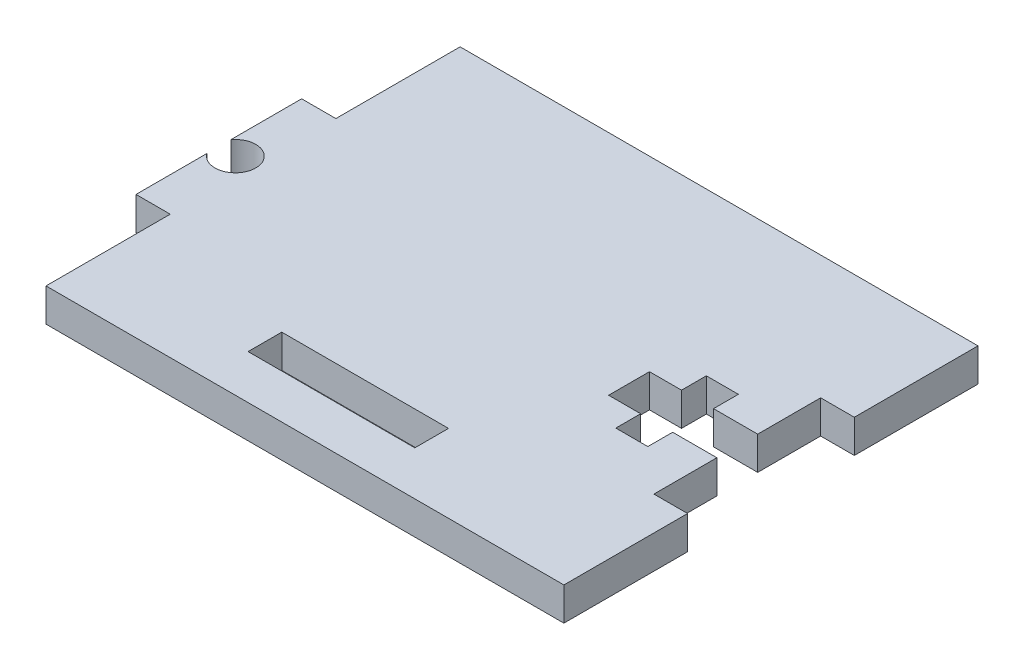
ISO-10303-21;
HEADER;
FILE_DESCRIPTION(('STEP AP214'),'2;1');
FILE_NAME('part.step','',(''),(''),'','','');
FILE_SCHEMA(('AUTOMOTIVE_DESIGN { 1 0 10303 214 1 1 1 1 }'));
ENDSEC;
DATA;
#1=APPLICATION_CONTEXT('core data for automotive mechanical design processes');
#2=APPLICATION_PROTOCOL_DEFINITION('international standard','automotive_design',2000,#1);
#3=PRODUCT_CONTEXT('',#1,'mechanical');
#4=PRODUCT('Part','Part','',(#3));
#5=PRODUCT_RELATED_PRODUCT_CATEGORY('part','',(#4));
#6=PRODUCT_DEFINITION_FORMATION('','',#4);
#7=PRODUCT_DEFINITION_CONTEXT('part definition',#1,'design');
#8=PRODUCT_DEFINITION('design','',#6,#7);
#9=PRODUCT_DEFINITION_SHAPE('','',#8);
#10=(LENGTH_UNIT() NAMED_UNIT(*) SI_UNIT(.MILLI.,.METRE.));
#11=(NAMED_UNIT(*) PLANE_ANGLE_UNIT() SI_UNIT($,.RADIAN.));
#12=(NAMED_UNIT(*) SI_UNIT($,.STERADIAN.) SOLID_ANGLE_UNIT());
#13=UNCERTAINTY_MEASURE_WITH_UNIT(LENGTH_MEASURE(1.E-05),#10,'distance_accuracy_value','');
#14=(GEOMETRIC_REPRESENTATION_CONTEXT(3) GLOBAL_UNCERTAINTY_ASSIGNED_CONTEXT((#13)) GLOBAL_UNIT_ASSIGNED_CONTEXT((#10,
#11,#12)) REPRESENTATION_CONTEXT('',''));
#15=CARTESIAN_POINT('',(0.,0.,0.));
#16=DIRECTION('',(0.,0.,1.));
#17=DIRECTION('',(1.,0.,0.));
#18=AXIS2_PLACEMENT_3D('',#15,#16,#17);
#19=CARTESIAN_POINT('',(-25.,3.,-18.75));
#20=DIRECTION('',(1.,0.,0.));
#21=DIRECTION('',(0.,0.,-1.));
#22=AXIS2_PLACEMENT_3D('',#19,#20,#21);
#23=PLANE('',#22);
#24=DIRECTION('',(0.,0.,1.));
#25=VECTOR('',#24,1.);
#26=CARTESIAN_POINT('',(-25.,3.,-18.75));
#27=LINE('',#26,#25);
#28=CARTESIAN_POINT('',(-25.,3.,1.08282039138538));
#29=VERTEX_POINT('',#28);
#30=CARTESIAN_POINT('',(-25.,3.,7.5));
#31=VERTEX_POINT('',#30);
#32=EDGE_CURVE('E240',#29,#31,#27,.T.);
#33=ORIENTED_EDGE('',*,*,#32,.F.);
#34=DIRECTION('',(0.,-1.,0.));
#35=VECTOR('',#34,1.);
#36=CARTESIAN_POINT('',(-25.,3.,1.08282039138538));
#37=LINE('',#36,#35);
#38=CARTESIAN_POINT('',(-25.,0.,1.08282039138538));
#39=VERTEX_POINT('',#38);
#40=EDGE_CURVE('E11',#29,#39,#37,.T.);
#41=ORIENTED_EDGE('',*,*,#40,.T.);
#42=DIRECTION('',(0.,0.,1.));
#43=VECTOR('',#42,1.);
#44=CARTESIAN_POINT('',(-25.,0.,-18.75));
#45=LINE('',#44,#43);
#46=CARTESIAN_POINT('',(-25.,0.,7.5));
#47=VERTEX_POINT('',#46);
#48=EDGE_CURVE('E238',#39,#47,#45,.T.);
#49=ORIENTED_EDGE('',*,*,#48,.T.);
#50=DIRECTION('',(0.,-1.,0.));
#51=VECTOR('',#50,1.);
#52=CARTESIAN_POINT('',(-25.,3.,7.5));
#53=LINE('',#52,#51);
#54=EDGE_CURVE('E628',#31,#47,#53,.T.);
#55=ORIENTED_EDGE('',*,*,#54,.F.);
#56=EDGE_LOOP('',(#33,#41,#49,#55));
#57=FACE_BOUND('',#56,.T.);
#58=ADVANCED_FACE('F33',(#57),#23,.F.);
#59=CARTESIAN_POINT('',(25.,3.,-18.75));
#60=DIRECTION('',(-1.,0.,0.));
#61=DIRECTION('',(0.,0.,1.));
#62=AXIS2_PLACEMENT_3D('',#59,#60,#61);
#63=PLANE('',#62);
#64=DIRECTION('',(0.,1.,0.));
#65=VECTOR('',#64,1.);
#66=CARTESIAN_POINT('',(25.,0.,7.55));
#67=LINE('',#66,#65);
#68=CARTESIAN_POINT('',(25.,0.,7.55));
#69=VERTEX_POINT('',#68);
#70=CARTESIAN_POINT('',(25.,3.,7.55));
#71=VERTEX_POINT('',#70);
#72=EDGE_CURVE('E691',#69,#71,#67,.T.);
#73=ORIENTED_EDGE('',*,*,#72,.T.);
#74=DIRECTION('',(0.,0.,-1.));
#75=VECTOR('',#74,1.);
#76=CARTESIAN_POINT('',(25.,3.,-18.75));
#77=LINE('',#76,#75);
#78=CARTESIAN_POINT('',(25.,3.,18.75));
#79=VERTEX_POINT('',#78);
#80=EDGE_CURVE('E306',#79,#71,#77,.T.);
#81=ORIENTED_EDGE('',*,*,#80,.F.);
#82=DIRECTION('',(0.,-1.,0.));
#83=VECTOR('',#82,1.);
#84=CARTESIAN_POINT('',(25.,3.,18.75));
#85=LINE('',#84,#83);
#86=CARTESIAN_POINT('',(25.,0.,18.75));
#87=VERTEX_POINT('',#86);
#88=EDGE_CURVE('E256',#79,#87,#85,.T.);
#89=ORIENTED_EDGE('',*,*,#88,.T.);
#90=DIRECTION('',(0.,0.,-1.));
#91=VECTOR('',#90,1.);
#92=CARTESIAN_POINT('',(25.,0.,-18.75));
#93=LINE('',#92,#91);
#94=EDGE_CURVE('E250',#87,#69,#93,.T.);
#95=ORIENTED_EDGE('',*,*,#94,.T.);
#96=EDGE_LOOP('',(#73,#81,#89,#95));
#97=FACE_BOUND('',#96,.T.);
#98=ADVANCED_FACE('F322',(#97),#63,.F.);
#99=CARTESIAN_POINT('',(0.,3.,0.));
#100=DIRECTION('',(0.,1.,0.));
#101=DIRECTION('',(0.,0.,1.));
#102=AXIS2_PLACEMENT_3D('',#99,#100,#101);
#103=PLANE('',#102);
#104=CARTESIAN_POINT('',(-23.5,3.,0.));
#105=DIRECTION('',(0.,-1.,0.));
#106=DIRECTION('',(0.,0.,-1.));
#107=AXIS2_PLACEMENT_3D('',#104,#105,#106);
#108=CIRCLE('',#107,1.85);
#109=CARTESIAN_POINT('',(-25.,3.,-1.08282039138538));
#110=VERTEX_POINT('',#109);
#111=EDGE_CURVE('E48',#110,#29,#108,.T.);
#112=ORIENTED_EDGE('',*,*,#111,.T.);
#113=ORIENTED_EDGE('',*,*,#32,.T.);
#114=DIRECTION('',(1.,0.,0.));
#115=VECTOR('',#114,1.);
#116=CARTESIAN_POINT('',(-25.,3.,7.5));
#117=LINE('',#116,#115);
#118=CARTESIAN_POINT('',(-21.9,3.,7.5));
#119=VERTEX_POINT('',#118);
#120=EDGE_CURVE('E631',#31,#119,#117,.T.);
#121=ORIENTED_EDGE('',*,*,#120,.T.);
#122=DIRECTION('',(0.,0.,1.));
#123=VECTOR('',#122,1.);
#124=CARTESIAN_POINT('',(-21.9,3.,18.75));
#125=LINE('',#124,#123);
#126=CARTESIAN_POINT('',(-21.9,3.,18.75));
#127=VERTEX_POINT('',#126);
#128=EDGE_CURVE('E634',#119,#127,#125,.T.);
#129=ORIENTED_EDGE('',*,*,#128,.T.);
#130=DIRECTION('',(1.,0.,0.));
#131=VECTOR('',#130,1.);
#132=CARTESIAN_POINT('',(-25.,3.,18.75));
#133=LINE('',#132,#131);
#134=EDGE_CURVE('E260',#127,#79,#133,.T.);
#135=ORIENTED_EDGE('',*,*,#134,.T.);
#136=ORIENTED_EDGE('',*,*,#80,.T.);
#137=DIRECTION('',(-1.,0.,0.));
#138=VECTOR('',#137,1.);
#139=CARTESIAN_POINT('',(25.,3.,7.55));
#140=LINE('',#139,#138);
#141=CARTESIAN_POINT('',(21.95,3.,7.55));
#142=VERTEX_POINT('',#141);
#143=EDGE_CURVE('E660',#71,#142,#140,.T.);
#144=ORIENTED_EDGE('',*,*,#143,.T.);
#145=DIRECTION('',(0.,0.,-1.));
#146=VECTOR('',#145,1.);
#147=CARTESIAN_POINT('',(21.95,3.,7.55));
#148=LINE('',#147,#146);
#149=CARTESIAN_POINT('',(21.95,3.,1.85));
#150=VERTEX_POINT('',#149);
#151=EDGE_CURVE('E687',#142,#150,#148,.T.);
#152=ORIENTED_EDGE('',*,*,#151,.T.);
#153=DIRECTION('',(-1.,0.,0.));
#154=VECTOR('',#153,1.);
#155=CARTESIAN_POINT('',(21.95,3.,1.85));
#156=LINE('',#155,#154);
#157=CARTESIAN_POINT('',(17.95,3.,1.85));
#158=VERTEX_POINT('',#157);
#159=EDGE_CURVE('E684',#150,#158,#156,.T.);
#160=ORIENTED_EDGE('',*,*,#159,.T.);
#161=DIRECTION('',(0.,0.,1.));
#162=VECTOR('',#161,1.);
#163=CARTESIAN_POINT('',(17.95,3.,1.85));
#164=LINE('',#163,#162);
#165=CARTESIAN_POINT('',(17.95,3.,4.1));
#166=VERTEX_POINT('',#165);
#167=EDGE_CURVE('E681',#158,#166,#164,.T.);
#168=ORIENTED_EDGE('',*,*,#167,.T.);
#169=DIRECTION('',(-1.,0.,0.));
#170=VECTOR('',#169,1.);
#171=CARTESIAN_POINT('',(17.95,3.,4.1));
#172=LINE('',#171,#170);
#173=CARTESIAN_POINT('',(15.05,3.,4.1));
#174=VERTEX_POINT('',#173);
#175=EDGE_CURVE('E678',#166,#174,#172,.T.);
#176=ORIENTED_EDGE('',*,*,#175,.T.);
#177=DIRECTION('',(0.,0.,-1.));
#178=VECTOR('',#177,1.);
#179=CARTESIAN_POINT('',(15.05,3.,4.1));
#180=LINE('',#179,#178);
#181=CARTESIAN_POINT('',(15.05,3.,1.85));
#182=VERTEX_POINT('',#181);
#183=EDGE_CURVE('E675',#174,#182,#180,.T.);
#184=ORIENTED_EDGE('',*,*,#183,.T.);
#185=DIRECTION('',(-1.,0.,0.));
#186=VECTOR('',#185,1.);
#187=CARTESIAN_POINT('',(15.05,3.,1.85));
#188=LINE('',#187,#186);
#189=CARTESIAN_POINT('',(12.15,3.,1.85));
#190=VERTEX_POINT('',#189);
#191=EDGE_CURVE('E652',#182,#190,#188,.T.);
#192=ORIENTED_EDGE('',*,*,#191,.T.);
#193=DIRECTION('',(0.,0.,1.));
#194=VECTOR('',#193,1.);
#195=CARTESIAN_POINT('',(12.15,3.,-1.85));
#196=LINE('',#195,#194);
#197=CARTESIAN_POINT('',(12.15,3.,-1.85));
#198=VERTEX_POINT('',#197);
#199=EDGE_CURVE('E711',#198,#190,#196,.T.);
#200=ORIENTED_EDGE('',*,*,#199,.F.);
#201=DIRECTION('',(-1.,0.,0.));
#202=VECTOR('',#201,1.);
#203=CARTESIAN_POINT('',(15.05,3.,-1.85));
#204=LINE('',#203,#202);
#205=CARTESIAN_POINT('',(15.05,3.,-1.85));
#206=VERTEX_POINT('',#205);
#207=EDGE_CURVE('E748',#206,#198,#204,.T.);
#208=ORIENTED_EDGE('',*,*,#207,.F.);
#209=DIRECTION('',(0.,0.,1.));
#210=VECTOR('',#209,1.);
#211=CARTESIAN_POINT('',(15.05,3.,-4.1));
#212=LINE('',#211,#210);
#213=CARTESIAN_POINT('',(15.05,3.,-4.1));
#214=VERTEX_POINT('',#213);
#215=EDGE_CURVE('E745',#214,#206,#212,.T.);
#216=ORIENTED_EDGE('',*,*,#215,.F.);
#217=DIRECTION('',(-1.,0.,0.));
#218=VECTOR('',#217,1.);
#219=CARTESIAN_POINT('',(17.95,3.,-4.1));
#220=LINE('',#219,#218);
#221=CARTESIAN_POINT('',(17.95,3.,-4.1));
#222=VERTEX_POINT('',#221);
#223=EDGE_CURVE('E742',#222,#214,#220,.T.);
#224=ORIENTED_EDGE('',*,*,#223,.F.);
#225=DIRECTION('',(0.,0.,-1.));
#226=VECTOR('',#225,1.);
#227=CARTESIAN_POINT('',(17.95,3.,-1.85));
#228=LINE('',#227,#226);
#229=CARTESIAN_POINT('',(17.95,3.,-1.85));
#230=VERTEX_POINT('',#229);
#231=EDGE_CURVE('E739',#230,#222,#228,.T.);
#232=ORIENTED_EDGE('',*,*,#231,.F.);
#233=DIRECTION('',(-1.,0.,0.));
#234=VECTOR('',#233,1.);
#235=CARTESIAN_POINT('',(21.95,3.,-1.85));
#236=LINE('',#235,#234);
#237=CARTESIAN_POINT('',(21.95,3.,-1.85));
#238=VERTEX_POINT('',#237);
#239=EDGE_CURVE('E736',#238,#230,#236,.T.);
#240=ORIENTED_EDGE('',*,*,#239,.F.);
#241=DIRECTION('',(0.,0.,1.));
#242=VECTOR('',#241,1.);
#243=CARTESIAN_POINT('',(21.95,3.,-7.55));
#244=LINE('',#243,#242);
#245=CARTESIAN_POINT('',(21.95,3.,-7.55));
#246=VERTEX_POINT('',#245);
#247=EDGE_CURVE('E733',#246,#238,#244,.T.);
#248=ORIENTED_EDGE('',*,*,#247,.F.);
#249=DIRECTION('',(-1.,0.,0.));
#250=VECTOR('',#249,1.);
#251=CARTESIAN_POINT('',(25.,3.,-7.55));
#252=LINE('',#251,#250);
#253=CARTESIAN_POINT('',(25.,3.,-7.55));
#254=VERTEX_POINT('',#253);
#255=EDGE_CURVE('E316',#254,#246,#252,.T.);
#256=ORIENTED_EDGE('',*,*,#255,.F.);
#257=CARTESIAN_POINT('',(25.,3.,-18.75));
#258=VERTEX_POINT('',#257);
#259=EDGE_CURVE('E255',#254,#258,#77,.T.);
#260=ORIENTED_EDGE('',*,*,#259,.T.);
#261=DIRECTION('',(-1.,0.,0.));
#262=VECTOR('',#261,1.);
#263=CARTESIAN_POINT('',(-25.,3.,-18.75));
#264=LINE('',#263,#262);
#265=CARTESIAN_POINT('',(-21.9,3.,-18.75));
#266=VERTEX_POINT('',#265);
#267=EDGE_CURVE('E277',#258,#266,#264,.T.);
#268=ORIENTED_EDGE('',*,*,#267,.T.);
#269=DIRECTION('',(0.,0.,1.));
#270=VECTOR('',#269,1.);
#271=CARTESIAN_POINT('',(-21.9,3.,-18.75));
#272=LINE('',#271,#270);
#273=CARTESIAN_POINT('',(-21.9,3.,-7.5));
#274=VERTEX_POINT('',#273);
#275=EDGE_CURVE('E643',#266,#274,#272,.T.);
#276=ORIENTED_EDGE('',*,*,#275,.T.);
#277=DIRECTION('',(-1.,0.,0.));
#278=VECTOR('',#277,1.);
#279=CARTESIAN_POINT('',(-25.,3.,-7.5));
#280=LINE('',#279,#278);
#281=CARTESIAN_POINT('',(-25.,3.,-7.5));
#282=VERTEX_POINT('',#281);
#283=EDGE_CURVE('E274',#274,#282,#280,.T.);
#284=ORIENTED_EDGE('',*,*,#283,.T.);
#285=EDGE_CURVE('E267',#282,#110,#27,.T.);
#286=ORIENTED_EDGE('',*,*,#285,.T.);
#287=EDGE_LOOP('',(#112,#113,#121,#129,#135,#136,#144,#152,#160,#168,#176,#184,#192,#200,#208,
#216,#224,#232,#240,#248,#256,#260,#268,#276,#284,#286));
#288=FACE_BOUND('',#287,.T.);
#289=DIRECTION('',(0.,0.,-1.));
#290=VECTOR('',#289,1.);
#291=CARTESIAN_POINT('',(7.49999999999999,3.,11.7));
#292=LINE('',#291,#290);
#293=CARTESIAN_POINT('',(7.49999999999999,3.,14.75));
#294=VERTEX_POINT('',#293);
#295=CARTESIAN_POINT('',(7.49999999999999,3.,11.7));
#296=VERTEX_POINT('',#295);
#297=EDGE_CURVE('E754',#294,#296,#292,.T.);
#298=ORIENTED_EDGE('',*,*,#297,.F.);
#299=DIRECTION('',(1.,0.,0.));
#300=VECTOR('',#299,1.);
#301=CARTESIAN_POINT('',(-7.60000000000001,3.,14.75));
#302=LINE('',#301,#300);
#303=CARTESIAN_POINT('',(-7.60000000000001,3.,14.75));
#304=VERTEX_POINT('',#303);
#305=EDGE_CURVE('E299',#304,#294,#302,.T.);
#306=ORIENTED_EDGE('',*,*,#305,.F.);
#307=DIRECTION('',(0.,0.,1.));
#308=VECTOR('',#307,1.);
#309=CARTESIAN_POINT('',(-7.60000000000001,3.,11.7));
#310=LINE('',#309,#308);
#311=CARTESIAN_POINT('',(-7.60000000000001,3.,11.7));
#312=VERTEX_POINT('',#311);
#313=EDGE_CURVE('E782',#312,#304,#310,.T.);
#314=ORIENTED_EDGE('',*,*,#313,.F.);
#315=DIRECTION('',(-1.,0.,0.));
#316=VECTOR('',#315,1.);
#317=CARTESIAN_POINT('',(-7.60000000000001,3.,11.7));
#318=LINE('',#317,#316);
#319=EDGE_CURVE('E780',#296,#312,#318,.T.);
#320=ORIENTED_EDGE('',*,*,#319,.F.);
#321=EDGE_LOOP('',(#298,#306,#314,#320));
#322=FACE_BOUND('',#321,.T.);
#323=ADVANCED_FACE('F270',(#288,#322),#103,.T.);
#324=CARTESIAN_POINT('',(0.,0.,0.));
#325=DIRECTION('',(0.,1.,0.));
#326=DIRECTION('',(0.,0.,1.));
#327=AXIS2_PLACEMENT_3D('',#324,#325,#326);
#328=PLANE('',#327);
#329=DIRECTION('',(1.,0.,0.));
#330=VECTOR('',#329,1.);
#331=CARTESIAN_POINT('',(-7.60000000000001,0.,14.75));
#332=LINE('',#331,#330);
#333=CARTESIAN_POINT('',(-7.60000000000001,0.,14.75));
#334=VERTEX_POINT('',#333);
#335=CARTESIAN_POINT('',(7.49999999999999,0.,14.75));
#336=VERTEX_POINT('',#335);
#337=EDGE_CURVE('E305',#334,#336,#332,.T.);
#338=ORIENTED_EDGE('',*,*,#337,.T.);
#339=DIRECTION('',(0.,0.,-1.));
#340=VECTOR('',#339,1.);
#341=CARTESIAN_POINT('',(7.49999999999999,0.,11.7));
#342=LINE('',#341,#340);
#343=CARTESIAN_POINT('',(7.49999999999999,0.,11.7));
#344=VERTEX_POINT('',#343);
#345=EDGE_CURVE('E768',#336,#344,#342,.T.);
#346=ORIENTED_EDGE('',*,*,#345,.T.);
#347=DIRECTION('',(-1.,0.,0.));
#348=VECTOR('',#347,1.);
#349=CARTESIAN_POINT('',(-7.60000000000001,0.,11.7));
#350=LINE('',#349,#348);
#351=CARTESIAN_POINT('',(-7.60000000000001,0.,11.7));
#352=VERTEX_POINT('',#351);
#353=EDGE_CURVE('E771',#344,#352,#350,.T.);
#354=ORIENTED_EDGE('',*,*,#353,.T.);
#355=DIRECTION('',(0.,0.,1.));
#356=VECTOR('',#355,1.);
#357=CARTESIAN_POINT('',(-7.60000000000001,0.,11.7));
#358=LINE('',#357,#356);
#359=EDGE_CURVE('E774',#352,#334,#358,.T.);
#360=ORIENTED_EDGE('',*,*,#359,.T.);
#361=EDGE_LOOP('',(#338,#346,#354,#360));
#362=FACE_BOUND('',#361,.T.);
#363=ORIENTED_EDGE('',*,*,#48,.F.);
#364=CARTESIAN_POINT('',(-23.5,0.,0.));
#365=DIRECTION('',(0.,-1.,0.));
#366=DIRECTION('',(0.,0.,-1.));
#367=AXIS2_PLACEMENT_3D('',#364,#365,#366);
#368=CIRCLE('',#367,1.85);
#369=CARTESIAN_POINT('',(-25.,0.,-1.08282039138538));
#370=VERTEX_POINT('',#369);
#371=EDGE_CURVE('E228',#370,#39,#368,.T.);
#372=ORIENTED_EDGE('',*,*,#371,.F.);
#373=CARTESIAN_POINT('',(-25.,0.,-7.5));
#374=VERTEX_POINT('',#373);
#375=EDGE_CURVE('E245',#374,#370,#45,.T.);
#376=ORIENTED_EDGE('',*,*,#375,.F.);
#377=DIRECTION('',(-1.,0.,0.));
#378=VECTOR('',#377,1.);
#379=CARTESIAN_POINT('',(-25.,0.,-7.5));
#380=LINE('',#379,#378);
#381=CARTESIAN_POINT('',(-21.9,0.,-7.5));
#382=VERTEX_POINT('',#381);
#383=EDGE_CURVE('E645',#382,#374,#380,.T.);
#384=ORIENTED_EDGE('',*,*,#383,.F.);
#385=DIRECTION('',(0.,0.,1.));
#386=VECTOR('',#385,1.);
#387=CARTESIAN_POINT('',(-21.9,0.,-18.75));
#388=LINE('',#387,#386);
#389=CARTESIAN_POINT('',(-21.9,0.,-18.75));
#390=VERTEX_POINT('',#389);
#391=EDGE_CURVE('E640',#390,#382,#388,.T.);
#392=ORIENTED_EDGE('',*,*,#391,.F.);
#393=DIRECTION('',(-1.,0.,0.));
#394=VECTOR('',#393,1.);
#395=CARTESIAN_POINT('',(-25.,0.,-18.75));
#396=LINE('',#395,#394);
#397=CARTESIAN_POINT('',(25.,0.,-18.75));
#398=VERTEX_POINT('',#397);
#399=EDGE_CURVE('E246',#398,#390,#396,.T.);
#400=ORIENTED_EDGE('',*,*,#399,.F.);
#401=CARTESIAN_POINT('',(25.,0.,-7.55));
#402=VERTEX_POINT('',#401);
#403=EDGE_CURVE('E281',#402,#398,#93,.T.);
#404=ORIENTED_EDGE('',*,*,#403,.F.);
#405=DIRECTION('',(-1.,0.,0.));
#406=VECTOR('',#405,1.);
#407=CARTESIAN_POINT('',(25.,0.,-7.55));
#408=LINE('',#407,#406);
#409=CARTESIAN_POINT('',(21.95,0.,-7.55));
#410=VERTEX_POINT('',#409);
#411=EDGE_CURVE('E707',#402,#410,#408,.T.);
#412=ORIENTED_EDGE('',*,*,#411,.T.);
#413=DIRECTION('',(0.,0.,1.));
#414=VECTOR('',#413,1.);
#415=CARTESIAN_POINT('',(21.95,0.,-7.55));
#416=LINE('',#415,#414);
#417=CARTESIAN_POINT('',(21.95,0.,-1.85));
#418=VERTEX_POINT('',#417);
#419=EDGE_CURVE('E710',#410,#418,#416,.T.);
#420=ORIENTED_EDGE('',*,*,#419,.T.);
#421=DIRECTION('',(-1.,0.,0.));
#422=VECTOR('',#421,1.);
#423=CARTESIAN_POINT('',(21.95,0.,-1.85));
#424=LINE('',#423,#422);
#425=CARTESIAN_POINT('',(17.95,0.,-1.85));
#426=VERTEX_POINT('',#425);
#427=EDGE_CURVE('E714',#418,#426,#424,.T.);
#428=ORIENTED_EDGE('',*,*,#427,.T.);
#429=DIRECTION('',(0.,0.,-1.));
#430=VECTOR('',#429,1.);
#431=CARTESIAN_POINT('',(17.95,0.,-1.85));
#432=LINE('',#431,#430);
#433=CARTESIAN_POINT('',(17.95,0.,-4.1));
#434=VERTEX_POINT('',#433);
#435=EDGE_CURVE('E717',#426,#434,#432,.T.);
#436=ORIENTED_EDGE('',*,*,#435,.T.);
#437=DIRECTION('',(-1.,0.,0.));
#438=VECTOR('',#437,1.);
#439=CARTESIAN_POINT('',(17.95,0.,-4.1));
#440=LINE('',#439,#438);
#441=CARTESIAN_POINT('',(15.05,0.,-4.1));
#442=VERTEX_POINT('',#441);
#443=EDGE_CURVE('E720',#434,#442,#440,.T.);
#444=ORIENTED_EDGE('',*,*,#443,.T.);
#445=DIRECTION('',(0.,0.,1.));
#446=VECTOR('',#445,1.);
#447=CARTESIAN_POINT('',(15.05,0.,-4.1));
#448=LINE('',#447,#446);
#449=CARTESIAN_POINT('',(15.05,0.,-1.85));
#450=VERTEX_POINT('',#449);
#451=EDGE_CURVE('E723',#442,#450,#448,.T.);
#452=ORIENTED_EDGE('',*,*,#451,.T.);
#453=DIRECTION('',(-1.,0.,0.));
#454=VECTOR('',#453,1.);
#455=CARTESIAN_POINT('',(15.05,0.,-1.85));
#456=LINE('',#455,#454);
#457=CARTESIAN_POINT('',(12.15,0.,-1.85));
#458=VERTEX_POINT('',#457);
#459=EDGE_CURVE('E726',#450,#458,#456,.T.);
#460=ORIENTED_EDGE('',*,*,#459,.T.);
#461=DIRECTION('',(0.,0.,1.));
#462=VECTOR('',#461,1.);
#463=CARTESIAN_POINT('',(12.15,0.,-1.85));
#464=LINE('',#463,#462);
#465=CARTESIAN_POINT('',(12.15,0.,1.85));
#466=VERTEX_POINT('',#465);
#467=EDGE_CURVE('E729',#458,#466,#464,.T.);
#468=ORIENTED_EDGE('',*,*,#467,.T.);
#469=DIRECTION('',(-1.,0.,0.));
#470=VECTOR('',#469,1.);
#471=CARTESIAN_POINT('',(15.05,0.,1.85));
#472=LINE('',#471,#470);
#473=CARTESIAN_POINT('',(15.05,0.,1.85));
#474=VERTEX_POINT('',#473);
#475=EDGE_CURVE('E656',#474,#466,#472,.T.);
#476=ORIENTED_EDGE('',*,*,#475,.F.);
#477=DIRECTION('',(0.,0.,-1.));
#478=VECTOR('',#477,1.);
#479=CARTESIAN_POINT('',(15.05,0.,4.1));
#480=LINE('',#479,#478);
#481=CARTESIAN_POINT('',(15.05,0.,4.1));
#482=VERTEX_POINT('',#481);
#483=EDGE_CURVE('E659',#482,#474,#480,.T.);
#484=ORIENTED_EDGE('',*,*,#483,.F.);
#485=DIRECTION('',(-1.,0.,0.));
#486=VECTOR('',#485,1.);
#487=CARTESIAN_POINT('',(17.95,0.,4.1));
#488=LINE('',#487,#486);
#489=CARTESIAN_POINT('',(17.95,0.,4.1));
#490=VERTEX_POINT('',#489);
#491=EDGE_CURVE('E662',#490,#482,#488,.T.);
#492=ORIENTED_EDGE('',*,*,#491,.F.);
#493=DIRECTION('',(0.,0.,1.));
#494=VECTOR('',#493,1.);
#495=CARTESIAN_POINT('',(17.95,0.,1.85));
#496=LINE('',#495,#494);
#497=CARTESIAN_POINT('',(17.95,0.,1.85));
#498=VERTEX_POINT('',#497);
#499=EDGE_CURVE('E664',#498,#490,#496,.T.);
#500=ORIENTED_EDGE('',*,*,#499,.F.);
#501=DIRECTION('',(-1.,0.,0.));
#502=VECTOR('',#501,1.);
#503=CARTESIAN_POINT('',(21.95,0.,1.85));
#504=LINE('',#503,#502);
#505=CARTESIAN_POINT('',(21.95,0.,1.85));
#506=VERTEX_POINT('',#505);
#507=EDGE_CURVE('E666',#506,#498,#504,.T.);
#508=ORIENTED_EDGE('',*,*,#507,.F.);
#509=DIRECTION('',(0.,0.,-1.));
#510=VECTOR('',#509,1.);
#511=CARTESIAN_POINT('',(21.95,0.,7.55));
#512=LINE('',#511,#510);
#513=CARTESIAN_POINT('',(21.95,0.,7.55));
#514=VERTEX_POINT('',#513);
#515=EDGE_CURVE('E668',#514,#506,#512,.T.);
#516=ORIENTED_EDGE('',*,*,#515,.F.);
#517=DIRECTION('',(-1.,0.,0.));
#518=VECTOR('',#517,1.);
#519=CARTESIAN_POINT('',(25.,0.,7.55));
#520=LINE('',#519,#518);
#521=EDGE_CURVE('E670',#69,#514,#520,.T.);
#522=ORIENTED_EDGE('',*,*,#521,.F.);
#523=ORIENTED_EDGE('',*,*,#94,.F.);
#524=DIRECTION('',(1.,0.,0.));
#525=VECTOR('',#524,1.);
#526=CARTESIAN_POINT('',(-25.,0.,18.75));
#527=LINE('',#526,#525);
#528=CARTESIAN_POINT('',(-21.9,0.,18.75));
#529=VERTEX_POINT('',#528);
#530=EDGE_CURVE('E248',#529,#87,#527,.T.);
#531=ORIENTED_EDGE('',*,*,#530,.F.);
#532=DIRECTION('',(0.,0.,1.));
#533=VECTOR('',#532,1.);
#534=CARTESIAN_POINT('',(-21.9,0.,18.75));
#535=LINE('',#534,#533);
#536=CARTESIAN_POINT('',(-21.9,0.,7.5));
#537=VERTEX_POINT('',#536);
#538=EDGE_CURVE('E56',#537,#529,#535,.T.);
#539=ORIENTED_EDGE('',*,*,#538,.F.);
#540=DIRECTION('',(1.,0.,0.));
#541=VECTOR('',#540,1.);
#542=CARTESIAN_POINT('',(-25.,0.,7.5));
#543=LINE('',#542,#541);
#544=EDGE_CURVE('E244',#47,#537,#543,.T.);
#545=ORIENTED_EDGE('',*,*,#544,.F.);
#546=EDGE_LOOP('',(#363,#372,#376,#384,#392,#400,#404,#412,#420,#428,#436,#444,#452,#460,#468,
#476,#484,#492,#500,#508,#516,#522,#523,#531,#539,#545));
#547=FACE_BOUND('',#546,.T.);
#548=ADVANCED_FACE('F242',(#362,#547),#328,.F.);
#549=ORIENTED_EDGE('',*,*,#259,.F.);
#550=DIRECTION('',(0.,1.,0.));
#551=VECTOR('',#550,1.);
#552=CARTESIAN_POINT('',(25.,0.,-7.55));
#553=LINE('',#552,#551);
#554=EDGE_CURVE('E731',#402,#254,#553,.T.);
#555=ORIENTED_EDGE('',*,*,#554,.F.);
#556=ORIENTED_EDGE('',*,*,#403,.T.);
#557=DIRECTION('',(0.,-1.,0.));
#558=VECTOR('',#557,1.);
#559=CARTESIAN_POINT('',(25.,3.,-18.75));
#560=LINE('',#559,#558);
#561=EDGE_CURVE('E259',#258,#398,#560,.T.);
#562=ORIENTED_EDGE('',*,*,#561,.F.);
#563=EDGE_LOOP('',(#549,#555,#556,#562));
#564=FACE_BOUND('',#563,.T.);
#565=ADVANCED_FACE('F35',(#564),#63,.F.);
#566=CARTESIAN_POINT('',(-25.,3.,-18.75));
#567=DIRECTION('',(0.,0.,1.));
#568=DIRECTION('',(1.,0.,0.));
#569=AXIS2_PLACEMENT_3D('',#566,#567,#568);
#570=PLANE('',#569);
#571=ORIENTED_EDGE('',*,*,#399,.T.);
#572=DIRECTION('',(0.,-1.,0.));
#573=VECTOR('',#572,1.);
#574=CARTESIAN_POINT('',(-21.9,3.,-18.75));
#575=LINE('',#574,#573);
#576=EDGE_CURVE('E320',#266,#390,#575,.T.);
#577=ORIENTED_EDGE('',*,*,#576,.F.);
#578=ORIENTED_EDGE('',*,*,#267,.F.);
#579=ORIENTED_EDGE('',*,*,#561,.T.);
#580=EDGE_LOOP('',(#571,#577,#578,#579));
#581=FACE_BOUND('',#580,.T.);
#582=ADVANCED_FACE('F319',(#581),#570,.F.);
#583=ORIENTED_EDGE('',*,*,#375,.T.);
#584=DIRECTION('',(0.,-1.,0.));
#585=VECTOR('',#584,1.);
#586=CARTESIAN_POINT('',(-25.,3.,-1.08282039138538));
#587=LINE('',#586,#585);
#588=EDGE_CURVE('E41',#370,#110,#587,.F.);
#589=ORIENTED_EDGE('',*,*,#588,.T.);
#590=ORIENTED_EDGE('',*,*,#285,.F.);
#591=DIRECTION('',(0.,-1.,0.));
#592=VECTOR('',#591,1.);
#593=CARTESIAN_POINT('',(-25.,3.,-7.5));
#594=LINE('',#593,#592);
#595=EDGE_CURVE('E650',#282,#374,#594,.T.);
#596=ORIENTED_EDGE('',*,*,#595,.T.);
#597=EDGE_LOOP('',(#583,#589,#590,#596));
#598=FACE_BOUND('',#597,.T.);
#599=ADVANCED_FACE('F265',(#598),#23,.F.);
#600=CARTESIAN_POINT('',(-25.,3.,18.75));
#601=DIRECTION('',(0.,0.,-1.));
#602=DIRECTION('',(-1.,0.,0.));
#603=AXIS2_PLACEMENT_3D('',#600,#601,#602);
#604=PLANE('',#603);
#605=ORIENTED_EDGE('',*,*,#134,.F.);
#606=DIRECTION('',(0.,-1.,0.));
#607=VECTOR('',#606,1.);
#608=CARTESIAN_POINT('',(-21.9,3.,18.75));
#609=LINE('',#608,#607);
#610=EDGE_CURVE('E638',#127,#529,#609,.T.);
#611=ORIENTED_EDGE('',*,*,#610,.T.);
#612=ORIENTED_EDGE('',*,*,#530,.T.);
#613=ORIENTED_EDGE('',*,*,#88,.F.);
#614=EDGE_LOOP('',(#605,#611,#612,#613));
#615=FACE_BOUND('',#614,.T.);
#616=ADVANCED_FACE('F336',(#615),#604,.F.);
#617=CARTESIAN_POINT('',(7.49999999999999,0.,11.7));
#618=DIRECTION('',(1.,0.,0.));
#619=DIRECTION('',(0.,0.,-1.));
#620=AXIS2_PLACEMENT_3D('',#617,#618,#619);
#621=PLANE('',#620);
#622=ORIENTED_EDGE('',*,*,#297,.T.);
#623=DIRECTION('',(0.,1.,0.));
#624=VECTOR('',#623,1.);
#625=CARTESIAN_POINT('',(7.49999999999999,0.,11.7));
#626=LINE('',#625,#624);
#627=EDGE_CURVE('E303',#344,#296,#626,.T.);
#628=ORIENTED_EDGE('',*,*,#627,.F.);
#629=ORIENTED_EDGE('',*,*,#345,.F.);
#630=DIRECTION('',(0.,1.,0.));
#631=VECTOR('',#630,1.);
#632=CARTESIAN_POINT('',(7.49999999999999,0.,14.75));
#633=LINE('',#632,#631);
#634=EDGE_CURVE('E285',#336,#294,#633,.T.);
#635=ORIENTED_EDGE('',*,*,#634,.T.);
#636=EDGE_LOOP('',(#622,#628,#629,#635));
#637=FACE_BOUND('',#636,.T.);
#638=ADVANCED_FACE('F340',(#637),#621,.F.);
#639=CARTESIAN_POINT('',(-7.60000000000001,0.,14.75));
#640=DIRECTION('',(0.,0.,1.));
#641=DIRECTION('',(1.,0.,0.));
#642=AXIS2_PLACEMENT_3D('',#639,#640,#641);
#643=PLANE('',#642);
#644=ORIENTED_EDGE('',*,*,#305,.T.);
#645=ORIENTED_EDGE('',*,*,#634,.F.);
#646=ORIENTED_EDGE('',*,*,#337,.F.);
#647=DIRECTION('',(0.,1.,0.));
#648=VECTOR('',#647,1.);
#649=CARTESIAN_POINT('',(-7.60000000000001,0.,14.75));
#650=LINE('',#649,#648);
#651=EDGE_CURVE('E291',#334,#304,#650,.T.);
#652=ORIENTED_EDGE('',*,*,#651,.T.);
#653=EDGE_LOOP('',(#644,#645,#646,#652));
#654=FACE_BOUND('',#653,.T.);
#655=ADVANCED_FACE('F345',(#654),#643,.F.);
#656=CARTESIAN_POINT('',(-7.60000000000001,0.,11.7));
#657=DIRECTION('',(-1.,0.,0.));
#658=DIRECTION('',(0.,0.,1.));
#659=AXIS2_PLACEMENT_3D('',#656,#657,#658);
#660=PLANE('',#659);
#661=ORIENTED_EDGE('',*,*,#313,.T.);
#662=ORIENTED_EDGE('',*,*,#651,.F.);
#663=ORIENTED_EDGE('',*,*,#359,.F.);
#664=DIRECTION('',(0.,1.,0.));
#665=VECTOR('',#664,1.);
#666=CARTESIAN_POINT('',(-7.60000000000001,0.,11.7));
#667=LINE('',#666,#665);
#668=EDGE_CURVE('E296',#352,#312,#667,.T.);
#669=ORIENTED_EDGE('',*,*,#668,.T.);
#670=EDGE_LOOP('',(#661,#662,#663,#669));
#671=FACE_BOUND('',#670,.T.);
#672=ADVANCED_FACE('F355',(#671),#660,.F.);
#673=CARTESIAN_POINT('',(-7.60000000000001,0.,11.7));
#674=DIRECTION('',(0.,0.,-1.));
#675=DIRECTION('',(-1.,0.,0.));
#676=AXIS2_PLACEMENT_3D('',#673,#674,#675);
#677=PLANE('',#676);
#678=ORIENTED_EDGE('',*,*,#319,.T.);
#679=ORIENTED_EDGE('',*,*,#668,.F.);
#680=ORIENTED_EDGE('',*,*,#353,.F.);
#681=ORIENTED_EDGE('',*,*,#627,.T.);
#682=EDGE_LOOP('',(#678,#679,#680,#681));
#683=FACE_BOUND('',#682,.T.);
#684=ADVANCED_FACE('F351',(#683),#677,.F.);
#685=CARTESIAN_POINT('',(12.15,0.,-1.85));
#686=DIRECTION('',(-1.,0.,0.));
#687=DIRECTION('',(0.,0.,1.));
#688=AXIS2_PLACEMENT_3D('',#685,#686,#687);
#689=PLANE('',#688);
#690=ORIENTED_EDGE('',*,*,#199,.T.);
#691=DIRECTION('',(0.,1.,0.));
#692=VECTOR('',#691,1.);
#693=CARTESIAN_POINT('',(12.15,0.,1.85));
#694=LINE('',#693,#692);
#695=EDGE_CURVE('E672',#466,#190,#694,.T.);
#696=ORIENTED_EDGE('',*,*,#695,.F.);
#697=ORIENTED_EDGE('',*,*,#467,.F.);
#698=DIRECTION('',(0.,1.,0.));
#699=VECTOR('',#698,1.);
#700=CARTESIAN_POINT('',(12.15,0.,-1.85));
#701=LINE('',#700,#699);
#702=EDGE_CURVE('E752',#458,#198,#701,.T.);
#703=ORIENTED_EDGE('',*,*,#702,.T.);
#704=EDGE_LOOP('',(#690,#696,#697,#703));
#705=FACE_BOUND('',#704,.T.);
#706=ADVANCED_FACE('F354',(#705),#689,.F.);
#707=CARTESIAN_POINT('',(15.05,0.,-1.85));
#708=DIRECTION('',(0.,0.,-1.));
#709=DIRECTION('',(-1.,0.,0.));
#710=AXIS2_PLACEMENT_3D('',#707,#708,#709);
#711=PLANE('',#710);
#712=ORIENTED_EDGE('',*,*,#207,.T.);
#713=ORIENTED_EDGE('',*,*,#702,.F.);
#714=ORIENTED_EDGE('',*,*,#459,.F.);
#715=DIRECTION('',(0.,1.,0.));
#716=VECTOR('',#715,1.);
#717=CARTESIAN_POINT('',(15.05,0.,-1.85));
#718=LINE('',#717,#716);
#719=EDGE_CURVE('E755',#450,#206,#718,.T.);
#720=ORIENTED_EDGE('',*,*,#719,.T.);
#721=EDGE_LOOP('',(#712,#713,#714,#720));
#722=FACE_BOUND('',#721,.T.);
#723=ADVANCED_FACE('F387',(#722),#711,.F.);
#724=CARTESIAN_POINT('',(15.05,0.,-4.1));
#725=DIRECTION('',(-1.,0.,0.));
#726=DIRECTION('',(0.,0.,1.));
#727=AXIS2_PLACEMENT_3D('',#724,#725,#726);
#728=PLANE('',#727);
#729=ORIENTED_EDGE('',*,*,#215,.T.);
#730=ORIENTED_EDGE('',*,*,#719,.F.);
#731=ORIENTED_EDGE('',*,*,#451,.F.);
#732=DIRECTION('',(0.,1.,0.));
#733=VECTOR('',#732,1.);
#734=CARTESIAN_POINT('',(15.05,0.,-4.1));
#735=LINE('',#734,#733);
#736=EDGE_CURVE('E757',#442,#214,#735,.T.);
#737=ORIENTED_EDGE('',*,*,#736,.T.);
#738=EDGE_LOOP('',(#729,#730,#731,#737));
#739=FACE_BOUND('',#738,.T.);
#740=ADVANCED_FACE('F383',(#739),#728,.F.);
#741=CARTESIAN_POINT('',(17.95,0.,-4.1));
#742=DIRECTION('',(0.,0.,-1.));
#743=DIRECTION('',(-1.,0.,0.));
#744=AXIS2_PLACEMENT_3D('',#741,#742,#743);
#745=PLANE('',#744);
#746=ORIENTED_EDGE('',*,*,#223,.T.);
#747=ORIENTED_EDGE('',*,*,#736,.F.);
#748=ORIENTED_EDGE('',*,*,#443,.F.);
#749=DIRECTION('',(0.,1.,0.));
#750=VECTOR('',#749,1.);
#751=CARTESIAN_POINT('',(17.95,0.,-4.1));
#752=LINE('',#751,#750);
#753=EDGE_CURVE('E759',#434,#222,#752,.T.);
#754=ORIENTED_EDGE('',*,*,#753,.T.);
#755=EDGE_LOOP('',(#746,#747,#748,#754));
#756=FACE_BOUND('',#755,.T.);
#757=ADVANCED_FACE('F379',(#756),#745,.F.);
#758=CARTESIAN_POINT('',(17.95,0.,-1.85));
#759=DIRECTION('',(1.,0.,0.));
#760=DIRECTION('',(0.,0.,-1.));
#761=AXIS2_PLACEMENT_3D('',#758,#759,#760);
#762=PLANE('',#761);
#763=ORIENTED_EDGE('',*,*,#231,.T.);
#764=ORIENTED_EDGE('',*,*,#753,.F.);
#765=ORIENTED_EDGE('',*,*,#435,.F.);
#766=DIRECTION('',(0.,1.,0.));
#767=VECTOR('',#766,1.);
#768=CARTESIAN_POINT('',(17.95,0.,-1.85));
#769=LINE('',#768,#767);
#770=EDGE_CURVE('E761',#426,#230,#769,.T.);
#771=ORIENTED_EDGE('',*,*,#770,.T.);
#772=EDGE_LOOP('',(#763,#764,#765,#771));
#773=FACE_BOUND('',#772,.T.);
#774=ADVANCED_FACE('F375',(#773),#762,.F.);
#775=CARTESIAN_POINT('',(21.95,0.,-1.85));
#776=DIRECTION('',(0.,0.,-1.));
#777=DIRECTION('',(-1.,0.,0.));
#778=AXIS2_PLACEMENT_3D('',#775,#776,#777);
#779=PLANE('',#778);
#780=ORIENTED_EDGE('',*,*,#239,.T.);
#781=ORIENTED_EDGE('',*,*,#770,.F.);
#782=ORIENTED_EDGE('',*,*,#427,.F.);
#783=DIRECTION('',(0.,1.,0.));
#784=VECTOR('',#783,1.);
#785=CARTESIAN_POINT('',(21.95,0.,-1.85));
#786=LINE('',#785,#784);
#787=EDGE_CURVE('E763',#418,#238,#786,.T.);
#788=ORIENTED_EDGE('',*,*,#787,.T.);
#789=EDGE_LOOP('',(#780,#781,#782,#788));
#790=FACE_BOUND('',#789,.T.);
#791=ADVANCED_FACE('F371',(#790),#779,.F.);
#792=CARTESIAN_POINT('',(21.95,0.,-7.55));
#793=DIRECTION('',(-1.,0.,0.));
#794=DIRECTION('',(0.,0.,1.));
#795=AXIS2_PLACEMENT_3D('',#792,#793,#794);
#796=PLANE('',#795);
#797=ORIENTED_EDGE('',*,*,#247,.T.);
#798=ORIENTED_EDGE('',*,*,#787,.F.);
#799=ORIENTED_EDGE('',*,*,#419,.F.);
#800=DIRECTION('',(0.,1.,0.));
#801=VECTOR('',#800,1.);
#802=CARTESIAN_POINT('',(21.95,0.,-7.55));
#803=LINE('',#802,#801);
#804=EDGE_CURVE('E765',#410,#246,#803,.T.);
#805=ORIENTED_EDGE('',*,*,#804,.T.);
#806=EDGE_LOOP('',(#797,#798,#799,#805));
#807=FACE_BOUND('',#806,.T.);
#808=ADVANCED_FACE('F367',(#807),#796,.F.);
#809=CARTESIAN_POINT('',(25.,0.,-7.55));
#810=DIRECTION('',(0.,0.,-1.));
#811=DIRECTION('',(-1.,0.,0.));
#812=AXIS2_PLACEMENT_3D('',#809,#810,#811);
#813=PLANE('',#812);
#814=ORIENTED_EDGE('',*,*,#255,.T.);
#815=ORIENTED_EDGE('',*,*,#804,.F.);
#816=ORIENTED_EDGE('',*,*,#411,.F.);
#817=ORIENTED_EDGE('',*,*,#554,.T.);
#818=EDGE_LOOP('',(#814,#815,#816,#817));
#819=FACE_BOUND('',#818,.T.);
#820=ADVANCED_FACE('F363',(#819),#813,.F.);
#821=CARTESIAN_POINT('',(25.,0.,7.55));
#822=DIRECTION('',(0.,0.,-1.));
#823=DIRECTION('',(-1.,0.,0.));
#824=AXIS2_PLACEMENT_3D('',#821,#822,#823);
#825=PLANE('',#824);
#826=ORIENTED_EDGE('',*,*,#143,.F.);
#827=ORIENTED_EDGE('',*,*,#72,.F.);
#828=ORIENTED_EDGE('',*,*,#521,.T.);
#829=DIRECTION('',(0.,1.,0.));
#830=VECTOR('',#829,1.);
#831=CARTESIAN_POINT('',(21.95,0.,7.55));
#832=LINE('',#831,#830);
#833=EDGE_CURVE('E693',#514,#142,#832,.T.);
#834=ORIENTED_EDGE('',*,*,#833,.T.);
#835=EDGE_LOOP('',(#826,#827,#828,#834));
#836=FACE_BOUND('',#835,.T.);
#837=ADVANCED_FACE('F366',(#836),#825,.T.);
#838=CARTESIAN_POINT('',(21.95,0.,7.55));
#839=DIRECTION('',(1.,0.,0.));
#840=DIRECTION('',(0.,0.,-1.));
#841=AXIS2_PLACEMENT_3D('',#838,#839,#840);
#842=PLANE('',#841);
#843=ORIENTED_EDGE('',*,*,#151,.F.);
#844=ORIENTED_EDGE('',*,*,#833,.F.);
#845=ORIENTED_EDGE('',*,*,#515,.T.);
#846=DIRECTION('',(0.,1.,0.));
#847=VECTOR('',#846,1.);
#848=CARTESIAN_POINT('',(21.95,0.,1.85));
#849=LINE('',#848,#847);
#850=EDGE_CURVE('E695',#506,#150,#849,.T.);
#851=ORIENTED_EDGE('',*,*,#850,.T.);
#852=EDGE_LOOP('',(#843,#844,#845,#851));
#853=FACE_BOUND('',#852,.T.);
#854=ADVANCED_FACE('F415',(#853),#842,.T.);
#855=CARTESIAN_POINT('',(21.95,0.,1.85));
#856=DIRECTION('',(0.,0.,-1.));
#857=DIRECTION('',(-1.,0.,0.));
#858=AXIS2_PLACEMENT_3D('',#855,#856,#857);
#859=PLANE('',#858);
#860=ORIENTED_EDGE('',*,*,#159,.F.);
#861=ORIENTED_EDGE('',*,*,#850,.F.);
#862=ORIENTED_EDGE('',*,*,#507,.T.);
#863=DIRECTION('',(0.,1.,0.));
#864=VECTOR('',#863,1.);
#865=CARTESIAN_POINT('',(17.95,0.,1.85));
#866=LINE('',#865,#864);
#867=EDGE_CURVE('E697',#498,#158,#866,.T.);
#868=ORIENTED_EDGE('',*,*,#867,.T.);
#869=EDGE_LOOP('',(#860,#861,#862,#868));
#870=FACE_BOUND('',#869,.T.);
#871=ADVANCED_FACE('F411',(#870),#859,.T.);
#872=CARTESIAN_POINT('',(17.95,0.,1.85));
#873=DIRECTION('',(-1.,0.,0.));
#874=DIRECTION('',(0.,0.,1.));
#875=AXIS2_PLACEMENT_3D('',#872,#873,#874);
#876=PLANE('',#875);
#877=ORIENTED_EDGE('',*,*,#167,.F.);
#878=ORIENTED_EDGE('',*,*,#867,.F.);
#879=ORIENTED_EDGE('',*,*,#499,.T.);
#880=DIRECTION('',(0.,1.,0.));
#881=VECTOR('',#880,1.);
#882=CARTESIAN_POINT('',(17.95,0.,4.1));
#883=LINE('',#882,#881);
#884=EDGE_CURVE('E699',#490,#166,#883,.T.);
#885=ORIENTED_EDGE('',*,*,#884,.T.);
#886=EDGE_LOOP('',(#877,#878,#879,#885));
#887=FACE_BOUND('',#886,.T.);
#888=ADVANCED_FACE('F407',(#887),#876,.T.);
#889=CARTESIAN_POINT('',(17.95,0.,4.1));
#890=DIRECTION('',(0.,0.,-1.));
#891=DIRECTION('',(-1.,0.,0.));
#892=AXIS2_PLACEMENT_3D('',#889,#890,#891);
#893=PLANE('',#892);
#894=ORIENTED_EDGE('',*,*,#175,.F.);
#895=ORIENTED_EDGE('',*,*,#884,.F.);
#896=ORIENTED_EDGE('',*,*,#491,.T.);
#897=DIRECTION('',(0.,1.,0.));
#898=VECTOR('',#897,1.);
#899=CARTESIAN_POINT('',(15.05,0.,4.1));
#900=LINE('',#899,#898);
#901=EDGE_CURVE('E701',#482,#174,#900,.T.);
#902=ORIENTED_EDGE('',*,*,#901,.T.);
#903=EDGE_LOOP('',(#894,#895,#896,#902));
#904=FACE_BOUND('',#903,.T.);
#905=ADVANCED_FACE('F403',(#904),#893,.T.);
#906=CARTESIAN_POINT('',(15.05,0.,4.1));
#907=DIRECTION('',(1.,0.,0.));
#908=DIRECTION('',(0.,0.,-1.));
#909=AXIS2_PLACEMENT_3D('',#906,#907,#908);
#910=PLANE('',#909);
#911=ORIENTED_EDGE('',*,*,#183,.F.);
#912=ORIENTED_EDGE('',*,*,#901,.F.);
#913=ORIENTED_EDGE('',*,*,#483,.T.);
#914=DIRECTION('',(0.,1.,0.));
#915=VECTOR('',#914,1.);
#916=CARTESIAN_POINT('',(15.05,0.,1.85));
#917=LINE('',#916,#915);
#918=EDGE_CURVE('E703',#474,#182,#917,.T.);
#919=ORIENTED_EDGE('',*,*,#918,.T.);
#920=EDGE_LOOP('',(#911,#912,#913,#919));
#921=FACE_BOUND('',#920,.T.);
#922=ADVANCED_FACE('F399',(#921),#910,.T.);
#923=CARTESIAN_POINT('',(15.05,0.,1.85));
#924=DIRECTION('',(0.,0.,-1.));
#925=DIRECTION('',(-1.,0.,0.));
#926=AXIS2_PLACEMENT_3D('',#923,#924,#925);
#927=PLANE('',#926);
#928=ORIENTED_EDGE('',*,*,#191,.F.);
#929=ORIENTED_EDGE('',*,*,#918,.F.);
#930=ORIENTED_EDGE('',*,*,#475,.T.);
#931=ORIENTED_EDGE('',*,*,#695,.T.);
#932=EDGE_LOOP('',(#928,#929,#930,#931));
#933=FACE_BOUND('',#932,.T.);
#934=ADVANCED_FACE('F395',(#933),#927,.T.);
#935=CARTESIAN_POINT('',(-25.,3.,-7.5));
#936=DIRECTION('',(0.,0.,1.));
#937=DIRECTION('',(1.,0.,0.));
#938=AXIS2_PLACEMENT_3D('',#935,#936,#937);
#939=PLANE('',#938);
#940=ORIENTED_EDGE('',*,*,#383,.T.);
#941=ORIENTED_EDGE('',*,*,#595,.F.);
#942=ORIENTED_EDGE('',*,*,#283,.F.);
#943=DIRECTION('',(0.,-1.,0.));
#944=VECTOR('',#943,1.);
#945=CARTESIAN_POINT('',(-21.9,3.,-7.5));
#946=LINE('',#945,#944);
#947=EDGE_CURVE('E653',#274,#382,#946,.T.);
#948=ORIENTED_EDGE('',*,*,#947,.T.);
#949=EDGE_LOOP('',(#940,#941,#942,#948));
#950=FACE_BOUND('',#949,.T.);
#951=ADVANCED_FACE('F398',(#950),#939,.F.);
#952=CARTESIAN_POINT('',(-21.9,3.,-18.75));
#953=DIRECTION('',(1.,0.,0.));
#954=DIRECTION('',(0.,0.,-1.));
#955=AXIS2_PLACEMENT_3D('',#952,#953,#954);
#956=PLANE('',#955);
#957=ORIENTED_EDGE('',*,*,#391,.T.);
#958=ORIENTED_EDGE('',*,*,#947,.F.);
#959=ORIENTED_EDGE('',*,*,#275,.F.);
#960=ORIENTED_EDGE('',*,*,#576,.T.);
#961=EDGE_LOOP('',(#957,#958,#959,#960));
#962=FACE_BOUND('',#961,.T.);
#963=ADVANCED_FACE('F423',(#962),#956,.F.);
#964=CARTESIAN_POINT('',(-21.9,3.,18.75));
#965=DIRECTION('',(1.,0.,0.));
#966=DIRECTION('',(0.,0.,-1.));
#967=AXIS2_PLACEMENT_3D('',#964,#965,#966);
#968=PLANE('',#967);
#969=ORIENTED_EDGE('',*,*,#538,.T.);
#970=ORIENTED_EDGE('',*,*,#610,.F.);
#971=ORIENTED_EDGE('',*,*,#128,.F.);
#972=DIRECTION('',(0.,-1.,0.));
#973=VECTOR('',#972,1.);
#974=CARTESIAN_POINT('',(-21.9,3.,7.5));
#975=LINE('',#974,#973);
#976=EDGE_CURVE('E626',#119,#537,#975,.T.);
#977=ORIENTED_EDGE('',*,*,#976,.T.);
#978=EDGE_LOOP('',(#969,#970,#971,#977));
#979=FACE_BOUND('',#978,.T.);
#980=ADVANCED_FACE('F426',(#979),#968,.F.);
#981=CARTESIAN_POINT('',(-25.,3.,7.5));
#982=DIRECTION('',(0.,0.,-1.));
#983=DIRECTION('',(-1.,0.,0.));
#984=AXIS2_PLACEMENT_3D('',#981,#982,#983);
#985=PLANE('',#984);
#986=ORIENTED_EDGE('',*,*,#544,.T.);
#987=ORIENTED_EDGE('',*,*,#976,.F.);
#988=ORIENTED_EDGE('',*,*,#120,.F.);
#989=ORIENTED_EDGE('',*,*,#54,.T.);
#990=EDGE_LOOP('',(#986,#987,#988,#989));
#991=FACE_BOUND('',#990,.T.);
#992=ADVANCED_FACE('F431',(#991),#985,.F.);
#993=CARTESIAN_POINT('',(-23.5,3.,0.));
#994=DIRECTION('',(0.,-1.,0.));
#995=DIRECTION('',(0.,0.,-1.));
#996=AXIS2_PLACEMENT_3D('',#993,#994,#995);
#997=CYLINDRICAL_SURFACE('',#996,1.85);
#998=ORIENTED_EDGE('',*,*,#111,.F.);
#999=ORIENTED_EDGE('',*,*,#588,.F.);
#1000=ORIENTED_EDGE('',*,*,#371,.T.);
#1001=ORIENTED_EDGE('',*,*,#40,.F.);
#1002=EDGE_LOOP('',(#998,#999,#1000,#1001));
#1003=FACE_BOUND('',#1002,.T.);
#1004=ADVANCED_FACE('F229',(#1003),#997,.F.);
#1005=CLOSED_SHELL('',(#58,#98,#323,#548,#565,#582,#599,#616,#638,#655,#672,#684,#706,#723,#740,
#757,#774,#791,#808,#820,#837,#854,#871,#888,#905,#922,#934,#951,#963,#980,#992,#1004));
#1006=MANIFOLD_SOLID_BREP('B2',#1005);
#1007=ADVANCED_BREP_SHAPE_REPRESENTATION('',(#18,#1006),#14);
#1008=SHAPE_DEFINITION_REPRESENTATION(#9,#1007);
ENDSEC;
END-ISO-10303-21;
